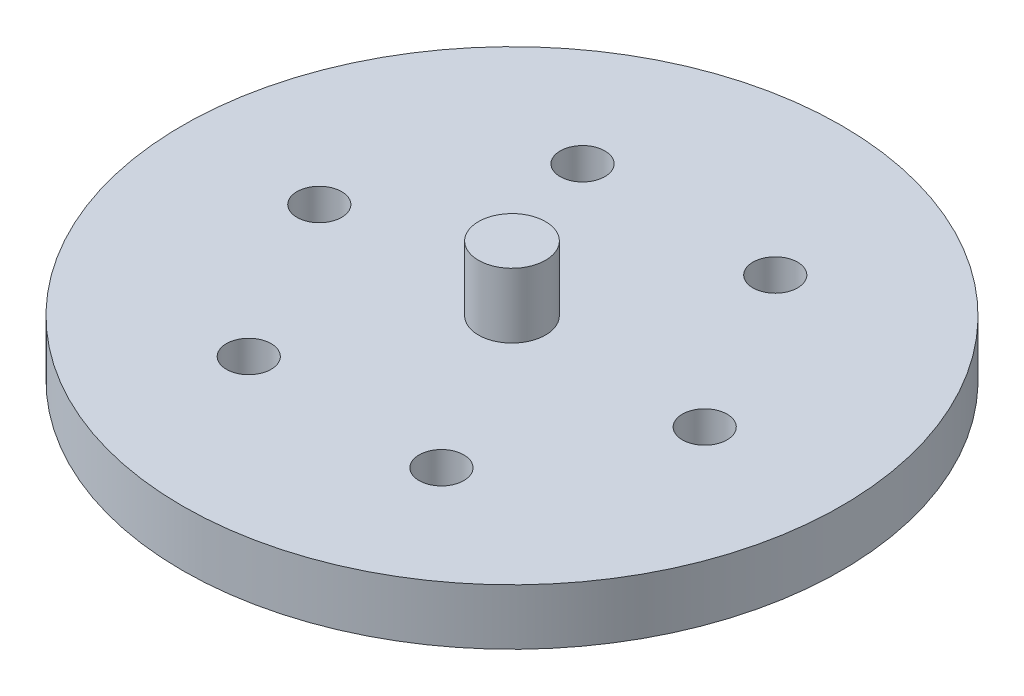
ISO-10303-21;
HEADER;
FILE_DESCRIPTION(('STEP AP214'),'2;1');
FILE_NAME('part.step','',(''),(''),'','','');
FILE_SCHEMA(('AUTOMOTIVE_DESIGN { 1 0 10303 214 1 1 1 1 }'));
ENDSEC;
DATA;
#1=APPLICATION_CONTEXT('core data for automotive mechanical design processes');
#2=APPLICATION_PROTOCOL_DEFINITION('international standard','automotive_design',2000,#1);
#3=PRODUCT_CONTEXT('',#1,'mechanical');
#4=PRODUCT('Part','Part','',(#3));
#5=PRODUCT_RELATED_PRODUCT_CATEGORY('part','',(#4));
#6=PRODUCT_DEFINITION_FORMATION('','',#4);
#7=PRODUCT_DEFINITION_CONTEXT('part definition',#1,'design');
#8=PRODUCT_DEFINITION('design','',#6,#7);
#9=PRODUCT_DEFINITION_SHAPE('','',#8);
#10=(LENGTH_UNIT() NAMED_UNIT(*) SI_UNIT(.MILLI.,.METRE.));
#11=(NAMED_UNIT(*) PLANE_ANGLE_UNIT() SI_UNIT($,.RADIAN.));
#12=(NAMED_UNIT(*) SI_UNIT($,.STERADIAN.) SOLID_ANGLE_UNIT());
#13=UNCERTAINTY_MEASURE_WITH_UNIT(LENGTH_MEASURE(1.E-05),#10,'distance_accuracy_value','');
#14=(GEOMETRIC_REPRESENTATION_CONTEXT(3) GLOBAL_UNCERTAINTY_ASSIGNED_CONTEXT((#13)) GLOBAL_UNIT_ASSIGNED_CONTEXT((#10,
#11,#12)) REPRESENTATION_CONTEXT('',''));
#15=CARTESIAN_POINT('',(0.,0.,0.));
#16=DIRECTION('',(0.,0.,1.));
#17=DIRECTION('',(1.,0.,0.));
#18=AXIS2_PLACEMENT_3D('',#15,#16,#17);
#19=CARTESIAN_POINT('',(0.,5.,0.));
#20=DIRECTION('',(0.,-1.,0.));
#21=DIRECTION('',(0.,0.,-1.));
#22=AXIS2_PLACEMENT_3D('',#19,#20,#21);
#23=CYLINDRICAL_SURFACE('',#22,29.5);
#24=CARTESIAN_POINT('',(0.,5.,0.));
#25=DIRECTION('',(0.,1.,0.));
#26=DIRECTION('',(0.,0.,1.));
#27=AXIS2_PLACEMENT_3D('',#24,#25,#26);
#28=CIRCLE('',#27,29.5);
#29=CARTESIAN_POINT('',(0.,5.,29.5));
#30=VERTEX_POINT('',#29);
#31=EDGE_CURVE('E10',#30,#30,#28,.T.);
#32=ORIENTED_EDGE('',*,*,#31,.F.);
#33=EDGE_LOOP('',(#32));
#34=FACE_BOUND('',#33,.T.);
#35=CARTESIAN_POINT('',(0.,0.,0.));
#36=DIRECTION('',(0.,1.,0.));
#37=DIRECTION('',(0.,0.,1.));
#38=AXIS2_PLACEMENT_3D('',#35,#36,#37);
#39=CIRCLE('',#38,29.5);
#40=CARTESIAN_POINT('',(0.,0.,29.5));
#41=VERTEX_POINT('',#40);
#42=EDGE_CURVE('E42',#41,#41,#39,.T.);
#43=ORIENTED_EDGE('',*,*,#42,.T.);
#44=EDGE_LOOP('',(#43));
#45=FACE_BOUND('',#44,.T.);
#46=ADVANCED_FACE('F39',(#34,#45),#23,.T.);
#47=CARTESIAN_POINT('',(0.,5.,0.));
#48=DIRECTION('',(0.,1.,0.));
#49=DIRECTION('',(0.,0.,1.));
#50=AXIS2_PLACEMENT_3D('',#47,#48,#49);
#51=PLANE('',#50);
#52=CARTESIAN_POINT('',(17.25,5.,0.));
#53=DIRECTION('',(0.,-1.,0.));
#54=DIRECTION('',(0.,0.,-1.));
#55=AXIS2_PLACEMENT_3D('',#52,#53,#54);
#56=CIRCLE('',#55,2.);
#57=CARTESIAN_POINT('',(17.25,5.,-2.));
#58=VERTEX_POINT('',#57);
#59=EDGE_CURVE('E54',#58,#58,#56,.T.);
#60=ORIENTED_EDGE('',*,*,#59,.T.);
#61=EDGE_LOOP('',(#60));
#62=FACE_BOUND('',#61,.T.);
#63=CARTESIAN_POINT('',(8.62500000000018,5.,14.9389382152815));
#64=DIRECTION('',(0.,-1.,0.));
#65=DIRECTION('',(0.,0.,-1.));
#66=AXIS2_PLACEMENT_3D('',#63,#64,#65);
#67=CIRCLE('',#66,2.);
#68=CARTESIAN_POINT('',(8.62500000000018,5.,12.9389382152815));
#69=VERTEX_POINT('',#68);
#70=EDGE_CURVE('E83',#69,#69,#67,.T.);
#71=ORIENTED_EDGE('',*,*,#70,.T.);
#72=EDGE_LOOP('',(#71));
#73=FACE_BOUND('',#72,.T.);
#74=CARTESIAN_POINT('',(-8.62499999999986,5.,14.9389382152816));
#75=DIRECTION('',(0.,-1.,0.));
#76=DIRECTION('',(0.,0.,-1.));
#77=AXIS2_PLACEMENT_3D('',#74,#75,#76);
#78=CIRCLE('',#77,2.);
#79=CARTESIAN_POINT('',(-8.62499999999986,5.,12.9389382152816));
#80=VERTEX_POINT('',#79);
#81=EDGE_CURVE('E57',#80,#80,#78,.T.);
#82=ORIENTED_EDGE('',*,*,#81,.T.);
#83=EDGE_LOOP('',(#82));
#84=FACE_BOUND('',#83,.T.);
#85=CARTESIAN_POINT('',(-17.25,5.,1.20456106190088E-13));
#86=DIRECTION('',(0.,-1.,0.));
#87=DIRECTION('',(0.,0.,-1.));
#88=AXIS2_PLACEMENT_3D('',#85,#86,#87);
#89=CIRCLE('',#88,2.);
#90=CARTESIAN_POINT('',(-17.25,5.,-1.99999999999988));
#91=VERTEX_POINT('',#90);
#92=EDGE_CURVE('E64',#91,#91,#89,.T.);
#93=ORIENTED_EDGE('',*,*,#92,.T.);
#94=EDGE_LOOP('',(#93));
#95=FACE_BOUND('',#94,.T.);
#96=CARTESIAN_POINT('',(-8.62500000000007,5.,-14.9389382152815));
#97=DIRECTION('',(0.,-1.,0.));
#98=DIRECTION('',(0.,0.,-1.));
#99=AXIS2_PLACEMENT_3D('',#96,#97,#98);
#100=CIRCLE('',#99,2.);
#101=CARTESIAN_POINT('',(-8.62500000000007,5.,-16.9389382152815));
#102=VERTEX_POINT('',#101);
#103=EDGE_CURVE('E70',#102,#102,#100,.T.);
#104=ORIENTED_EDGE('',*,*,#103,.T.);
#105=EDGE_LOOP('',(#104));
#106=FACE_BOUND('',#105,.T.);
#107=CARTESIAN_POINT('',(8.62499999999997,5.,-14.9389382152816));
#108=DIRECTION('',(0.,-1.,0.));
#109=DIRECTION('',(0.,0.,-1.));
#110=AXIS2_PLACEMENT_3D('',#107,#108,#109);
#111=CIRCLE('',#110,2.);
#112=CARTESIAN_POINT('',(8.62499999999997,5.,-16.9389382152816));
#113=VERTEX_POINT('',#112);
#114=EDGE_CURVE('E76',#113,#113,#111,.T.);
#115=ORIENTED_EDGE('',*,*,#114,.T.);
#116=EDGE_LOOP('',(#115));
#117=FACE_BOUND('',#116,.T.);
#118=CARTESIAN_POINT('',(0.,5.,0.));
#119=DIRECTION('',(0.,1.,0.));
#120=DIRECTION('',(0.,0.,1.));
#121=AXIS2_PLACEMENT_3D('',#118,#119,#120);
#122=CIRCLE('',#121,3.);
#123=CARTESIAN_POINT('',(0.,5.,3.));
#124=VERTEX_POINT('',#123);
#125=EDGE_CURVE('E51',#124,#124,#122,.T.);
#126=ORIENTED_EDGE('',*,*,#125,.F.);
#127=EDGE_LOOP('',(#126));
#128=FACE_BOUND('',#127,.T.);
#129=ORIENTED_EDGE('',*,*,#31,.T.);
#130=EDGE_LOOP('',(#129));
#131=FACE_BOUND('',#130,.T.);
#132=ADVANCED_FACE('F112',(#62,#73,#84,#95,#106,#117,#128,#131),#51,.T.);
#133=CARTESIAN_POINT('',(0.,0.,0.));
#134=DIRECTION('',(0.,1.,0.));
#135=DIRECTION('',(0.,0.,1.));
#136=AXIS2_PLACEMENT_3D('',#133,#134,#135);
#137=PLANE('',#136);
#138=CARTESIAN_POINT('',(0.,0.,0.));
#139=DIRECTION('',(0.,-1.,0.));
#140=DIRECTION('',(0.,0.,-1.));
#141=AXIS2_PLACEMENT_3D('',#138,#139,#140);
#142=CIRCLE('',#141,3.);
#143=CARTESIAN_POINT('',(0.,0.,-3.));
#144=VERTEX_POINT('',#143);
#145=EDGE_CURVE('E93',#144,#144,#142,.T.);
#146=ORIENTED_EDGE('',*,*,#145,.F.);
#147=EDGE_LOOP('',(#146));
#148=FACE_BOUND('',#147,.T.);
#149=CARTESIAN_POINT('',(17.25,0.,0.));
#150=DIRECTION('',(0.,-1.,0.));
#151=DIRECTION('',(0.,0.,-1.));
#152=AXIS2_PLACEMENT_3D('',#149,#150,#151);
#153=CIRCLE('',#152,2.);
#154=CARTESIAN_POINT('',(17.25,0.,-2.));
#155=VERTEX_POINT('',#154);
#156=EDGE_CURVE('E82',#155,#155,#153,.T.);
#157=ORIENTED_EDGE('',*,*,#156,.F.);
#158=EDGE_LOOP('',(#157));
#159=FACE_BOUND('',#158,.T.);
#160=CARTESIAN_POINT('',(8.62500000000018,0.,14.9389382152815));
#161=DIRECTION('',(0.,-1.,0.));
#162=DIRECTION('',(0.,0.,-1.));
#163=AXIS2_PLACEMENT_3D('',#160,#161,#162);
#164=CIRCLE('',#163,2.);
#165=CARTESIAN_POINT('',(8.62500000000018,0.,12.9389382152815));
#166=VERTEX_POINT('',#165);
#167=EDGE_CURVE('E61',#166,#166,#164,.T.);
#168=ORIENTED_EDGE('',*,*,#167,.F.);
#169=EDGE_LOOP('',(#168));
#170=FACE_BOUND('',#169,.T.);
#171=CARTESIAN_POINT('',(-8.62499999999986,0.,14.9389382152816));
#172=DIRECTION('',(0.,-1.,0.));
#173=DIRECTION('',(0.,0.,-1.));
#174=AXIS2_PLACEMENT_3D('',#171,#172,#173);
#175=CIRCLE('',#174,2.);
#176=CARTESIAN_POINT('',(-8.62499999999986,0.,12.9389382152816));
#177=VERTEX_POINT('',#176);
#178=EDGE_CURVE('E60',#177,#177,#175,.T.);
#179=ORIENTED_EDGE('',*,*,#178,.F.);
#180=EDGE_LOOP('',(#179));
#181=FACE_BOUND('',#180,.T.);
#182=CARTESIAN_POINT('',(-17.25,0.,1.20456106190088E-13));
#183=DIRECTION('',(0.,-1.,0.));
#184=DIRECTION('',(0.,0.,-1.));
#185=AXIS2_PLACEMENT_3D('',#182,#183,#184);
#186=CIRCLE('',#185,2.);
#187=CARTESIAN_POINT('',(-17.25,0.,-1.99999999999988));
#188=VERTEX_POINT('',#187);
#189=EDGE_CURVE('E67',#188,#188,#186,.T.);
#190=ORIENTED_EDGE('',*,*,#189,.F.);
#191=EDGE_LOOP('',(#190));
#192=FACE_BOUND('',#191,.T.);
#193=CARTESIAN_POINT('',(-8.62500000000007,0.,-14.9389382152815));
#194=DIRECTION('',(0.,-1.,0.));
#195=DIRECTION('',(0.,0.,-1.));
#196=AXIS2_PLACEMENT_3D('',#193,#194,#195);
#197=CIRCLE('',#196,2.);
#198=CARTESIAN_POINT('',(-8.62500000000007,0.,-16.9389382152815));
#199=VERTEX_POINT('',#198);
#200=EDGE_CURVE('E73',#199,#199,#197,.T.);
#201=ORIENTED_EDGE('',*,*,#200,.F.);
#202=EDGE_LOOP('',(#201));
#203=FACE_BOUND('',#202,.T.);
#204=CARTESIAN_POINT('',(8.62499999999997,0.,-14.9389382152816));
#205=DIRECTION('',(0.,-1.,0.));
#206=DIRECTION('',(0.,0.,-1.));
#207=AXIS2_PLACEMENT_3D('',#204,#205,#206);
#208=CIRCLE('',#207,2.);
#209=CARTESIAN_POINT('',(8.62499999999997,0.,-16.9389382152816));
#210=VERTEX_POINT('',#209);
#211=EDGE_CURVE('E79',#210,#210,#208,.T.);
#212=ORIENTED_EDGE('',*,*,#211,.F.);
#213=EDGE_LOOP('',(#212));
#214=FACE_BOUND('',#213,.T.);
#215=ORIENTED_EDGE('',*,*,#42,.F.);
#216=EDGE_LOOP('',(#215));
#217=FACE_BOUND('',#216,.T.);
#218=ADVANCED_FACE('F108',(#148,#159,#170,#181,#192,#203,#214,#217),#137,.F.);
#219=CARTESIAN_POINT('',(0.,10.8,0.));
#220=DIRECTION('',(0.,-1.,0.));
#221=DIRECTION('',(0.,0.,-1.));
#222=AXIS2_PLACEMENT_3D('',#219,#220,#221);
#223=CYLINDRICAL_SURFACE('',#222,3.);
#224=CARTESIAN_POINT('',(0.,10.8,0.));
#225=DIRECTION('',(0.,1.,0.));
#226=DIRECTION('',(0.,0.,1.));
#227=AXIS2_PLACEMENT_3D('',#224,#225,#226);
#228=CIRCLE('',#227,3.);
#229=CARTESIAN_POINT('',(0.,10.8,3.));
#230=VERTEX_POINT('',#229);
#231=EDGE_CURVE('E49',#230,#230,#228,.T.);
#232=ORIENTED_EDGE('',*,*,#231,.F.);
#233=EDGE_LOOP('',(#232));
#234=FACE_BOUND('',#233,.T.);
#235=ORIENTED_EDGE('',*,*,#125,.T.);
#236=EDGE_LOOP('',(#235));
#237=FACE_BOUND('',#236,.T.);
#238=ADVANCED_FACE('F111',(#234,#237),#223,.T.);
#239=CARTESIAN_POINT('',(0.,10.8,0.));
#240=DIRECTION('',(0.,1.,0.));
#241=DIRECTION('',(0.,0.,1.));
#242=AXIS2_PLACEMENT_3D('',#239,#240,#241);
#243=PLANE('',#242);
#244=ORIENTED_EDGE('',*,*,#231,.T.);
#245=EDGE_LOOP('',(#244));
#246=FACE_BOUND('',#245,.T.);
#247=ADVANCED_FACE('F142',(#246),#243,.T.);
#248=CARTESIAN_POINT('',(8.62499999999997,5.,-14.9389382152816));
#249=DIRECTION('',(0.,-1.,0.));
#250=DIRECTION('',(0.,0.,-1.));
#251=AXIS2_PLACEMENT_3D('',#248,#249,#250);
#252=CYLINDRICAL_SURFACE('',#251,2.);
#253=ORIENTED_EDGE('',*,*,#114,.F.);
#254=EDGE_LOOP('',(#253));
#255=FACE_BOUND('',#254,.T.);
#256=ORIENTED_EDGE('',*,*,#211,.T.);
#257=EDGE_LOOP('',(#256));
#258=FACE_BOUND('',#257,.T.);
#259=ADVANCED_FACE('F145',(#255,#258),#252,.F.);
#260=CARTESIAN_POINT('',(-8.62500000000007,5.,-14.9389382152815));
#261=DIRECTION('',(0.,-1.,0.));
#262=DIRECTION('',(0.,0.,-1.));
#263=AXIS2_PLACEMENT_3D('',#260,#261,#262);
#264=CYLINDRICAL_SURFACE('',#263,2.);
#265=ORIENTED_EDGE('',*,*,#103,.F.);
#266=EDGE_LOOP('',(#265));
#267=FACE_BOUND('',#266,.T.);
#268=ORIENTED_EDGE('',*,*,#200,.T.);
#269=EDGE_LOOP('',(#268));
#270=FACE_BOUND('',#269,.T.);
#271=ADVANCED_FACE('F155',(#267,#270),#264,.F.);
#272=CARTESIAN_POINT('',(-17.25,5.,1.20456106190088E-13));
#273=DIRECTION('',(0.,-1.,0.));
#274=DIRECTION('',(0.,0.,-1.));
#275=AXIS2_PLACEMENT_3D('',#272,#273,#274);
#276=CYLINDRICAL_SURFACE('',#275,2.);
#277=ORIENTED_EDGE('',*,*,#92,.F.);
#278=EDGE_LOOP('',(#277));
#279=FACE_BOUND('',#278,.T.);
#280=ORIENTED_EDGE('',*,*,#189,.T.);
#281=EDGE_LOOP('',(#280));
#282=FACE_BOUND('',#281,.T.);
#283=ADVANCED_FACE('F151',(#279,#282),#276,.F.);
#284=CARTESIAN_POINT('',(-8.62499999999986,5.,14.9389382152816));
#285=DIRECTION('',(0.,-1.,0.));
#286=DIRECTION('',(0.,0.,-1.));
#287=AXIS2_PLACEMENT_3D('',#284,#285,#286);
#288=CYLINDRICAL_SURFACE('',#287,2.);
#289=ORIENTED_EDGE('',*,*,#81,.F.);
#290=EDGE_LOOP('',(#289));
#291=FACE_BOUND('',#290,.T.);
#292=ORIENTED_EDGE('',*,*,#178,.T.);
#293=EDGE_LOOP('',(#292));
#294=FACE_BOUND('',#293,.T.);
#295=ADVANCED_FACE('F147',(#291,#294),#288,.F.);
#296=CARTESIAN_POINT('',(8.62500000000018,5.,14.9389382152815));
#297=DIRECTION('',(0.,-1.,0.));
#298=DIRECTION('',(0.,0.,-1.));
#299=AXIS2_PLACEMENT_3D('',#296,#297,#298);
#300=CYLINDRICAL_SURFACE('',#299,2.);
#301=ORIENTED_EDGE('',*,*,#70,.F.);
#302=EDGE_LOOP('',(#301));
#303=FACE_BOUND('',#302,.T.);
#304=ORIENTED_EDGE('',*,*,#167,.T.);
#305=EDGE_LOOP('',(#304));
#306=FACE_BOUND('',#305,.T.);
#307=ADVANCED_FACE('F150',(#303,#306),#300,.F.);
#308=CARTESIAN_POINT('',(17.25,5.,0.));
#309=DIRECTION('',(0.,-1.,0.));
#310=DIRECTION('',(0.,0.,-1.));
#311=AXIS2_PLACEMENT_3D('',#308,#309,#310);
#312=CYLINDRICAL_SURFACE('',#311,2.);
#313=ORIENTED_EDGE('',*,*,#59,.F.);
#314=EDGE_LOOP('',(#313));
#315=FACE_BOUND('',#314,.T.);
#316=ORIENTED_EDGE('',*,*,#156,.T.);
#317=EDGE_LOOP('',(#316));
#318=FACE_BOUND('',#317,.T.);
#319=ADVANCED_FACE('F104',(#315,#318),#312,.F.);
#320=CARTESIAN_POINT('',(0.,1.,0.));
#321=DIRECTION('',(0.,-1.,0.));
#322=DIRECTION('',(0.,0.,-1.));
#323=AXIS2_PLACEMENT_3D('',#320,#321,#322);
#324=CYLINDRICAL_SURFACE('',#323,3.);
#325=CARTESIAN_POINT('',(0.,1.,0.));
#326=DIRECTION('',(0.,-1.,0.));
#327=DIRECTION('',(0.,0.,-1.));
#328=AXIS2_PLACEMENT_3D('',#325,#326,#327);
#329=CIRCLE('',#328,3.);
#330=CARTESIAN_POINT('',(0.,1.,-3.));
#331=VERTEX_POINT('',#330);
#332=EDGE_CURVE('E86',#331,#331,#329,.T.);
#333=ORIENTED_EDGE('',*,*,#332,.F.);
#334=EDGE_LOOP('',(#333));
#335=FACE_BOUND('',#334,.T.);
#336=ORIENTED_EDGE('',*,*,#145,.T.);
#337=EDGE_LOOP('',(#336));
#338=FACE_BOUND('',#337,.T.);
#339=ADVANCED_FACE('F101',(#335,#338),#324,.F.);
#340=CARTESIAN_POINT('',(0.,1.,0.));
#341=DIRECTION('',(0.,-1.,0.));
#342=DIRECTION('',(0.,0.,-1.));
#343=AXIS2_PLACEMENT_3D('',#340,#341,#342);
#344=PLANE('',#343);
#345=ORIENTED_EDGE('',*,*,#332,.T.);
#346=EDGE_LOOP('',(#345));
#347=FACE_BOUND('',#346,.T.);
#348=ADVANCED_FACE('F99',(#347),#344,.T.);
#349=CLOSED_SHELL('',(#46,#132,#218,#238,#247,#259,#271,#283,#295,#307,#319,#339,#348));
#350=MANIFOLD_SOLID_BREP('B2',#349);
#351=ADVANCED_BREP_SHAPE_REPRESENTATION('',(#18,#350),#14);
#352=SHAPE_DEFINITION_REPRESENTATION(#9,#351);
ENDSEC;
END-ISO-10303-21;
